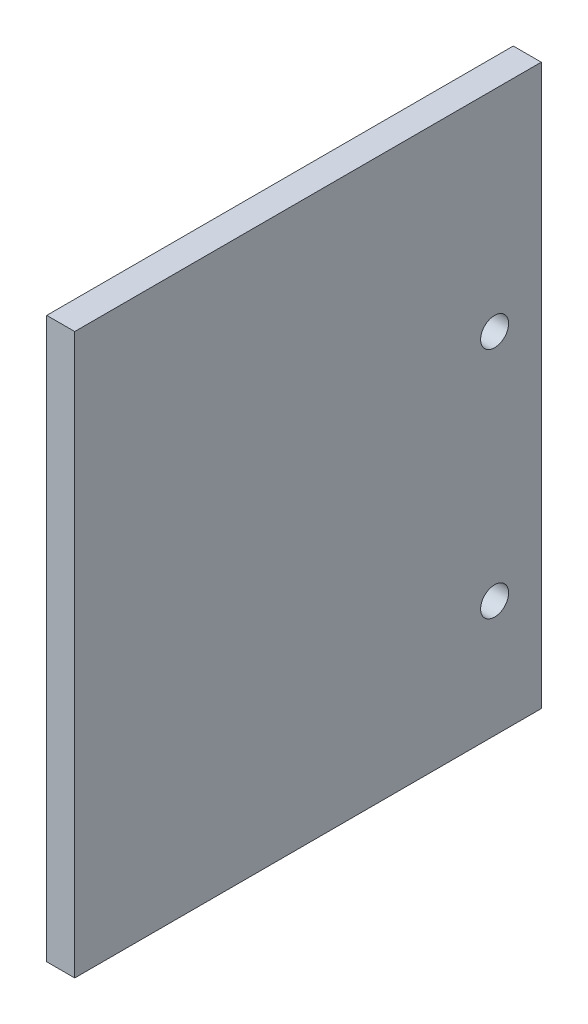
ISO-10303-21;
HEADER;
FILE_DESCRIPTION(('STEP AP214'),'2;1');
FILE_NAME('part.step','',(''),(''),'','','');
FILE_SCHEMA(('AUTOMOTIVE_DESIGN { 1 0 10303 214 1 1 1 1 }'));
ENDSEC;
DATA;
#1=APPLICATION_CONTEXT('core data for automotive mechanical design processes');
#2=APPLICATION_PROTOCOL_DEFINITION('international standard','automotive_design',2000,#1);
#3=PRODUCT_CONTEXT('',#1,'mechanical');
#4=PRODUCT('Part','Part','',(#3));
#5=PRODUCT_RELATED_PRODUCT_CATEGORY('part','',(#4));
#6=PRODUCT_DEFINITION_FORMATION('','',#4);
#7=PRODUCT_DEFINITION_CONTEXT('part definition',#1,'design');
#8=PRODUCT_DEFINITION('design','',#6,#7);
#9=PRODUCT_DEFINITION_SHAPE('','',#8);
#10=(LENGTH_UNIT() NAMED_UNIT(*) SI_UNIT(.MILLI.,.METRE.));
#11=(NAMED_UNIT(*) PLANE_ANGLE_UNIT() SI_UNIT($,.RADIAN.));
#12=(NAMED_UNIT(*) SI_UNIT($,.STERADIAN.) SOLID_ANGLE_UNIT());
#13=UNCERTAINTY_MEASURE_WITH_UNIT(LENGTH_MEASURE(1.E-05),#10,'distance_accuracy_value','');
#14=(GEOMETRIC_REPRESENTATION_CONTEXT(3) GLOBAL_UNCERTAINTY_ASSIGNED_CONTEXT((#13)) GLOBAL_UNIT_ASSIGNED_CONTEXT((#10,
#11,#12)) REPRESENTATION_CONTEXT('',''));
#15=CARTESIAN_POINT('',(0.,0.,0.));
#16=DIRECTION('',(0.,0.,1.));
#17=DIRECTION('',(1.,0.,0.));
#18=AXIS2_PLACEMENT_3D('',#15,#16,#17);
#19=CARTESIAN_POINT('',(3.,30.,-25.));
#20=DIRECTION('',(0.,0.,1.));
#21=DIRECTION('',(0.,-1.,0.));
#22=AXIS2_PLACEMENT_3D('',#19,#20,#21);
#23=PLANE('',#22);
#24=DIRECTION('',(0.,1.,0.));
#25=VECTOR('',#24,1.);
#26=CARTESIAN_POINT('',(0.,30.,-25.));
#27=LINE('',#26,#25);
#28=CARTESIAN_POINT('',(0.,-30.,-25.));
#29=VERTEX_POINT('',#28);
#30=CARTESIAN_POINT('',(0.,30.,-25.));
#31=VERTEX_POINT('',#30);
#32=EDGE_CURVE('E96',#29,#31,#27,.T.);
#33=ORIENTED_EDGE('',*,*,#32,.T.);
#34=DIRECTION('',(-1.,0.,0.));
#35=VECTOR('',#34,1.);
#36=CARTESIAN_POINT('',(3.,30.,-25.));
#37=LINE('',#36,#35);
#38=CARTESIAN_POINT('',(3.,30.,-25.));
#39=VERTEX_POINT('',#38);
#40=EDGE_CURVE('E11',#39,#31,#37,.T.);
#41=ORIENTED_EDGE('',*,*,#40,.F.);
#42=DIRECTION('',(0.,1.,0.));
#43=VECTOR('',#42,1.);
#44=CARTESIAN_POINT('',(3.,30.,-25.));
#45=LINE('',#44,#43);
#46=CARTESIAN_POINT('',(3.,-30.,-25.));
#47=VERTEX_POINT('',#46);
#48=EDGE_CURVE('E84',#47,#39,#45,.T.);
#49=ORIENTED_EDGE('',*,*,#48,.F.);
#50=DIRECTION('',(-1.,0.,0.));
#51=VECTOR('',#50,1.);
#52=CARTESIAN_POINT('',(3.,-30.,-25.));
#53=LINE('',#52,#51);
#54=EDGE_CURVE('E92',#47,#29,#53,.T.);
#55=ORIENTED_EDGE('',*,*,#54,.T.);
#56=EDGE_LOOP('',(#33,#41,#49,#55));
#57=FACE_BOUND('',#56,.T.);
#58=ADVANCED_FACE('F33',(#57),#23,.F.);
#59=CARTESIAN_POINT('',(3.,30.,25.));
#60=DIRECTION('',(0.,-1.,0.));
#61=DIRECTION('',(0.,0.,-1.));
#62=AXIS2_PLACEMENT_3D('',#59,#60,#61);
#63=PLANE('',#62);
#64=DIRECTION('',(0.,0.,1.));
#65=VECTOR('',#64,1.);
#66=CARTESIAN_POINT('',(0.,30.,25.));
#67=LINE('',#66,#65);
#68=CARTESIAN_POINT('',(0.,30.,25.));
#69=VERTEX_POINT('',#68);
#70=EDGE_CURVE('E88',#31,#69,#67,.T.);
#71=ORIENTED_EDGE('',*,*,#70,.T.);
#72=DIRECTION('',(-1.,0.,0.));
#73=VECTOR('',#72,1.);
#74=CARTESIAN_POINT('',(3.,30.,25.));
#75=LINE('',#74,#73);
#76=CARTESIAN_POINT('',(3.,30.,25.));
#77=VERTEX_POINT('',#76);
#78=EDGE_CURVE('E41',#77,#69,#75,.T.);
#79=ORIENTED_EDGE('',*,*,#78,.F.);
#80=DIRECTION('',(0.,0.,1.));
#81=VECTOR('',#80,1.);
#82=CARTESIAN_POINT('',(3.,30.,25.));
#83=LINE('',#82,#81);
#84=EDGE_CURVE('E79',#39,#77,#83,.T.);
#85=ORIENTED_EDGE('',*,*,#84,.F.);
#86=ORIENTED_EDGE('',*,*,#40,.T.);
#87=EDGE_LOOP('',(#71,#79,#85,#86));
#88=FACE_BOUND('',#87,.T.);
#89=ADVANCED_FACE('F87',(#88),#63,.F.);
#90=CARTESIAN_POINT('',(3.,30.,25.));
#91=DIRECTION('',(0.,0.,-1.));
#92=DIRECTION('',(0.,1.,0.));
#93=AXIS2_PLACEMENT_3D('',#90,#91,#92);
#94=PLANE('',#93);
#95=DIRECTION('',(0.,-1.,0.));
#96=VECTOR('',#95,1.);
#97=CARTESIAN_POINT('',(0.,30.,25.));
#98=LINE('',#97,#96);
#99=CARTESIAN_POINT('',(0.,-30.,25.));
#100=VERTEX_POINT('',#99);
#101=EDGE_CURVE('E66',#69,#100,#98,.T.);
#102=ORIENTED_EDGE('',*,*,#101,.T.);
#103=DIRECTION('',(-1.,0.,0.));
#104=VECTOR('',#103,1.);
#105=CARTESIAN_POINT('',(3.,-30.,25.));
#106=LINE('',#105,#104);
#107=CARTESIAN_POINT('',(3.,-30.,25.));
#108=VERTEX_POINT('',#107);
#109=EDGE_CURVE('E89',#108,#100,#106,.T.);
#110=ORIENTED_EDGE('',*,*,#109,.F.);
#111=DIRECTION('',(0.,-1.,0.));
#112=VECTOR('',#111,1.);
#113=CARTESIAN_POINT('',(3.,30.,25.));
#114=LINE('',#113,#112);
#115=EDGE_CURVE('E82',#77,#108,#114,.T.);
#116=ORIENTED_EDGE('',*,*,#115,.F.);
#117=ORIENTED_EDGE('',*,*,#78,.T.);
#118=EDGE_LOOP('',(#102,#110,#116,#117));
#119=FACE_BOUND('',#118,.T.);
#120=ADVANCED_FACE('F90',(#119),#94,.F.);
#121=CARTESIAN_POINT('',(3.,-30.,25.));
#122=DIRECTION('',(0.,1.,0.));
#123=DIRECTION('',(0.,0.,1.));
#124=AXIS2_PLACEMENT_3D('',#121,#122,#123);
#125=PLANE('',#124);
#126=DIRECTION('',(0.,0.,-1.));
#127=VECTOR('',#126,1.);
#128=CARTESIAN_POINT('',(0.,-30.,25.));
#129=LINE('',#128,#127);
#130=EDGE_CURVE('E72',#100,#29,#129,.T.);
#131=ORIENTED_EDGE('',*,*,#130,.T.);
#132=ORIENTED_EDGE('',*,*,#54,.F.);
#133=DIRECTION('',(0.,0.,-1.));
#134=VECTOR('',#133,1.);
#135=CARTESIAN_POINT('',(3.,-30.,25.));
#136=LINE('',#135,#134);
#137=EDGE_CURVE('E49',#108,#47,#136,.T.);
#138=ORIENTED_EDGE('',*,*,#137,.F.);
#139=ORIENTED_EDGE('',*,*,#109,.T.);
#140=EDGE_LOOP('',(#131,#132,#138,#139));
#141=FACE_BOUND('',#140,.T.);
#142=ADVANCED_FACE('F104',(#141),#125,.F.);
#143=CARTESIAN_POINT('',(3.,0.,0.));
#144=DIRECTION('',(1.,0.,0.));
#145=DIRECTION('',(0.,0.,-1.));
#146=AXIS2_PLACEMENT_3D('',#143,#144,#145);
#147=PLANE('',#146);
#148=CARTESIAN_POINT('',(3.,-17.5,-20.));
#149=DIRECTION('',(1.,0.,0.));
#150=DIRECTION('',(0.,0.,-1.));
#151=AXIS2_PLACEMENT_3D('',#148,#149,#150);
#152=CIRCLE('',#151,1.5);
#153=CARTESIAN_POINT('',(3.,-17.5,-21.5));
#154=VERTEX_POINT('',#153);
#155=EDGE_CURVE('E116',#154,#154,#152,.T.);
#156=ORIENTED_EDGE('',*,*,#155,.F.);
#157=EDGE_LOOP('',(#156));
#158=FACE_BOUND('',#157,.T.);
#159=CARTESIAN_POINT('',(3.,7.5,-20.));
#160=DIRECTION('',(1.,0.,0.));
#161=DIRECTION('',(0.,0.,-1.));
#162=AXIS2_PLACEMENT_3D('',#159,#160,#161);
#163=CIRCLE('',#162,1.5);
#164=CARTESIAN_POINT('',(3.,7.5,-21.5));
#165=VERTEX_POINT('',#164);
#166=EDGE_CURVE('E110',#165,#165,#163,.T.);
#167=ORIENTED_EDGE('',*,*,#166,.F.);
#168=EDGE_LOOP('',(#167));
#169=FACE_BOUND('',#168,.T.);
#170=ORIENTED_EDGE('',*,*,#48,.T.);
#171=ORIENTED_EDGE('',*,*,#84,.T.);
#172=ORIENTED_EDGE('',*,*,#115,.T.);
#173=ORIENTED_EDGE('',*,*,#137,.T.);
#174=EDGE_LOOP('',(#170,#171,#172,#173));
#175=FACE_BOUND('',#174,.T.);
#176=ADVANCED_FACE('F80',(#158,#169,#175),#147,.T.);
#177=CARTESIAN_POINT('',(0.,0.,0.));
#178=DIRECTION('',(1.,0.,0.));
#179=DIRECTION('',(0.,0.,-1.));
#180=AXIS2_PLACEMENT_3D('',#177,#178,#179);
#181=PLANE('',#180);
#182=CARTESIAN_POINT('',(0.,-17.5,-20.));
#183=DIRECTION('',(1.,0.,0.));
#184=DIRECTION('',(0.,0.,-1.));
#185=AXIS2_PLACEMENT_3D('',#182,#183,#184);
#186=CIRCLE('',#185,1.5);
#187=CARTESIAN_POINT('',(0.,-17.5,-21.5));
#188=VERTEX_POINT('',#187);
#189=EDGE_CURVE('E113',#188,#188,#186,.T.);
#190=ORIENTED_EDGE('',*,*,#189,.T.);
#191=EDGE_LOOP('',(#190));
#192=FACE_BOUND('',#191,.T.);
#193=CARTESIAN_POINT('',(0.,7.5,-20.));
#194=DIRECTION('',(1.,0.,0.));
#195=DIRECTION('',(0.,0.,-1.));
#196=AXIS2_PLACEMENT_3D('',#193,#194,#195);
#197=CIRCLE('',#196,1.5);
#198=CARTESIAN_POINT('',(0.,7.5,-21.5));
#199=VERTEX_POINT('',#198);
#200=EDGE_CURVE('E99',#199,#199,#197,.T.);
#201=ORIENTED_EDGE('',*,*,#200,.T.);
#202=EDGE_LOOP('',(#201));
#203=FACE_BOUND('',#202,.T.);
#204=ORIENTED_EDGE('',*,*,#32,.F.);
#205=ORIENTED_EDGE('',*,*,#130,.F.);
#206=ORIENTED_EDGE('',*,*,#101,.F.);
#207=ORIENTED_EDGE('',*,*,#70,.F.);
#208=EDGE_LOOP('',(#204,#205,#206,#207));
#209=FACE_BOUND('',#208,.T.);
#210=ADVANCED_FACE('F107',(#192,#203,#209),#181,.F.);
#211=CARTESIAN_POINT('',(0.,7.5,-20.));
#212=DIRECTION('',(1.,0.,0.));
#213=DIRECTION('',(0.,0.,-1.));
#214=AXIS2_PLACEMENT_3D('',#211,#212,#213);
#215=CYLINDRICAL_SURFACE('',#214,1.5);
#216=ORIENTED_EDGE('',*,*,#200,.F.);
#217=EDGE_LOOP('',(#216));
#218=FACE_BOUND('',#217,.T.);
#219=ORIENTED_EDGE('',*,*,#166,.T.);
#220=EDGE_LOOP('',(#219));
#221=FACE_BOUND('',#220,.T.);
#222=ADVANCED_FACE('F127',(#218,#221),#215,.F.);
#223=CARTESIAN_POINT('',(0.,-17.5,-20.));
#224=DIRECTION('',(1.,0.,0.));
#225=DIRECTION('',(0.,0.,-1.));
#226=AXIS2_PLACEMENT_3D('',#223,#224,#225);
#227=CYLINDRICAL_SURFACE('',#226,1.5);
#228=ORIENTED_EDGE('',*,*,#189,.F.);
#229=EDGE_LOOP('',(#228));
#230=FACE_BOUND('',#229,.T.);
#231=ORIENTED_EDGE('',*,*,#155,.T.);
#232=EDGE_LOOP('',(#231));
#233=FACE_BOUND('',#232,.T.);
#234=ADVANCED_FACE('F124',(#230,#233),#227,.F.);
#235=CLOSED_SHELL('',(#58,#89,#120,#142,#176,#210,#222,#234));
#236=MANIFOLD_SOLID_BREP('B2',#235);
#237=ADVANCED_BREP_SHAPE_REPRESENTATION('',(#18,#236),#14);
#238=SHAPE_DEFINITION_REPRESENTATION(#9,#237);
ENDSEC;
END-ISO-10303-21;
